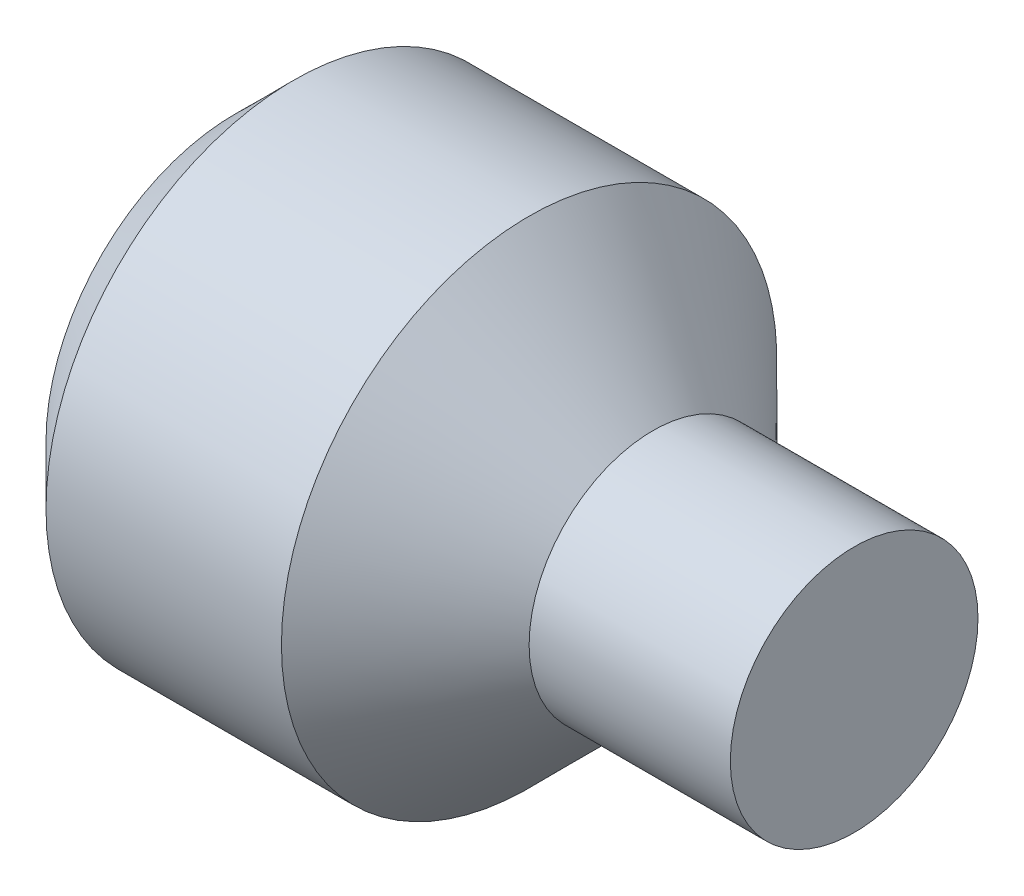
ISO-10303-21;
HEADER;
FILE_DESCRIPTION(('STEP AP214'),'2;1');
FILE_NAME('part.step','',(''),(''),'','','');
FILE_SCHEMA(('AUTOMOTIVE_DESIGN { 1 0 10303 214 1 1 1 1 }'));
ENDSEC;
DATA;
#1=APPLICATION_CONTEXT('core data for automotive mechanical design processes');
#2=APPLICATION_PROTOCOL_DEFINITION('international standard','automotive_design',2000,#1);
#3=PRODUCT_CONTEXT('',#1,'mechanical');
#4=PRODUCT('Part','Part','',(#3));
#5=PRODUCT_RELATED_PRODUCT_CATEGORY('part','',(#4));
#6=PRODUCT_DEFINITION_FORMATION('','',#4);
#7=PRODUCT_DEFINITION_CONTEXT('part definition',#1,'design');
#8=PRODUCT_DEFINITION('design','',#6,#7);
#9=PRODUCT_DEFINITION_SHAPE('','',#8);
#10=(LENGTH_UNIT() NAMED_UNIT(*) SI_UNIT(.MILLI.,.METRE.));
#11=(NAMED_UNIT(*) PLANE_ANGLE_UNIT() SI_UNIT($,.RADIAN.));
#12=(NAMED_UNIT(*) SI_UNIT($,.STERADIAN.) SOLID_ANGLE_UNIT());
#13=UNCERTAINTY_MEASURE_WITH_UNIT(LENGTH_MEASURE(1.E-05),#10,'distance_accuracy_value','');
#14=(GEOMETRIC_REPRESENTATION_CONTEXT(3) GLOBAL_UNCERTAINTY_ASSIGNED_CONTEXT((#13)) GLOBAL_UNIT_ASSIGNED_CONTEXT((#10,
#11,#12)) REPRESENTATION_CONTEXT('',''));
#15=CARTESIAN_POINT('',(0.,0.,0.));
#16=DIRECTION('',(0.,0.,1.));
#17=DIRECTION('',(1.,0.,0.));
#18=AXIS2_PLACEMENT_3D('',#15,#16,#17);
#19=CARTESIAN_POINT('',(0.699999999943163,0.350000000000001,0.606217782649104));
#20=DIRECTION('',(-1.,0.,0.));
#21=DIRECTION('',(0.,0.,1.));
#22=AXIS2_PLACEMENT_3D('',#19,#20,#21);
#23=PLANE('',#22);
#24=CARTESIAN_POINT('',(0.699999999943163,0.,0.));
#25=DIRECTION('',(-1.,0.,0.));
#26=DIRECTION('',(0.,0.,1.));
#27=AXIS2_PLACEMENT_3D('',#24,#25,#26);
#28=CIRCLE('',#27,0.35);
#29=CARTESIAN_POINT('',(0.699999999943163,0.175000000000001,0.303108891324552));
#30=VERTEX_POINT('',#29);
#31=CARTESIAN_POINT('',(0.699999999943163,0.350000000000001,0.));
#32=VERTEX_POINT('',#31);
#33=EDGE_CURVE('E50',#30,#32,#28,.T.);
#34=ORIENTED_EDGE('',*,*,#33,.F.);
#35=DIRECTION('',(0.,0.866025403784439,-0.5));
#36=VECTOR('',#35,1.);
#37=CARTESIAN_POINT('',(0.699999999943163,0.,0.404145188432736));
#38=LINE('',#37,#36);
#39=CARTESIAN_POINT('',(0.699999999943163,0.350000000000001,0.202072594216368));
#40=VERTEX_POINT('',#39);
#41=EDGE_CURVE('E245',#30,#40,#38,.T.);
#42=ORIENTED_EDGE('',*,*,#41,.T.);
#43=DIRECTION('',(0.,0.,-1.));
#44=VECTOR('',#43,1.);
#45=CARTESIAN_POINT('',(0.699999999943163,0.350000000000001,0.202072594216368));
#46=LINE('',#45,#44);
#47=EDGE_CURVE('E238',#40,#32,#46,.T.);
#48=ORIENTED_EDGE('',*,*,#47,.T.);
#49=EDGE_LOOP('',(#34,#42,#48));
#50=FACE_BOUND('',#49,.T.);
#51=ADVANCED_FACE('F39',(#50),#23,.T.);
#52=CARTESIAN_POINT('',(0.699999999943163,0.175000000000001,-0.303108891324552));
#53=VERTEX_POINT('',#52);
#54=EDGE_CURVE('E11',#32,#53,#28,.T.);
#55=ORIENTED_EDGE('',*,*,#54,.F.);
#56=CARTESIAN_POINT('',(0.699999999943163,0.350000000000001,-0.202072594216368));
#57=VERTEX_POINT('',#56);
#58=EDGE_CURVE('E241',#32,#57,#46,.T.);
#59=ORIENTED_EDGE('',*,*,#58,.T.);
#60=DIRECTION('',(0.,-0.866025403784439,-0.5));
#61=VECTOR('',#60,1.);
#62=CARTESIAN_POINT('',(0.699999999943163,0.350000000000001,-0.202072594216368));
#63=LINE('',#62,#61);
#64=EDGE_CURVE('E234',#57,#53,#63,.T.);
#65=ORIENTED_EDGE('',*,*,#64,.T.);
#66=EDGE_LOOP('',(#55,#59,#65));
#67=FACE_BOUND('',#66,.T.);
#68=ADVANCED_FACE('F126',(#67),#23,.T.);
#69=CARTESIAN_POINT('',(0.699999999943149,-0.174999999999999,-0.303108891324552));
#70=VERTEX_POINT('',#69);
#71=EDGE_CURVE('E48',#53,#70,#28,.T.);
#72=ORIENTED_EDGE('',*,*,#71,.F.);
#73=CARTESIAN_POINT('',(0.699999999943163,0.,-0.404145188432736));
#74=VERTEX_POINT('',#73);
#75=EDGE_CURVE('E237',#53,#74,#63,.T.);
#76=ORIENTED_EDGE('',*,*,#75,.T.);
#77=DIRECTION('',(0.,-0.866025403784439,0.5));
#78=VECTOR('',#77,1.);
#79=CARTESIAN_POINT('',(0.699999999943163,0.,-0.404145188432736));
#80=LINE('',#79,#78);
#81=EDGE_CURVE('E230',#74,#70,#80,.T.);
#82=ORIENTED_EDGE('',*,*,#81,.T.);
#83=EDGE_LOOP('',(#72,#76,#82));
#84=FACE_BOUND('',#83,.T.);
#85=ADVANCED_FACE('F131',(#84),#23,.T.);
#86=CARTESIAN_POINT('',(0.699999999943149,-0.35,0.));
#87=VERTEX_POINT('',#86);
#88=EDGE_CURVE('E249',#70,#87,#28,.T.);
#89=ORIENTED_EDGE('',*,*,#88,.F.);
#90=CARTESIAN_POINT('',(0.699999999943149,-0.349999999999999,-0.202072594216368));
#91=VERTEX_POINT('',#90);
#92=EDGE_CURVE('E233',#70,#91,#80,.T.);
#93=ORIENTED_EDGE('',*,*,#92,.T.);
#94=DIRECTION('',(0.,0.,1.));
#95=VECTOR('',#94,1.);
#96=CARTESIAN_POINT('',(0.699999999943149,-0.349999999999999,-0.202072594216368));
#97=LINE('',#96,#95);
#98=EDGE_CURVE('E201',#91,#87,#97,.T.);
#99=ORIENTED_EDGE('',*,*,#98,.T.);
#100=EDGE_LOOP('',(#89,#93,#99));
#101=FACE_BOUND('',#100,.T.);
#102=ADVANCED_FACE('F256',(#101),#23,.T.);
#103=CARTESIAN_POINT('',(0.699999999943149,-0.174999999999999,0.303108891324552));
#104=VERTEX_POINT('',#103);
#105=EDGE_CURVE('E57',#87,#104,#28,.T.);
#106=ORIENTED_EDGE('',*,*,#105,.F.);
#107=CARTESIAN_POINT('',(0.699999999943149,-0.349999999999999,0.202072594216368));
#108=VERTEX_POINT('',#107);
#109=EDGE_CURVE('E229',#87,#108,#97,.T.);
#110=ORIENTED_EDGE('',*,*,#109,.T.);
#111=DIRECTION('',(0.,0.866025403784439,0.5));
#112=VECTOR('',#111,1.);
#113=CARTESIAN_POINT('',(0.699999999943149,-0.349999999999999,0.202072594216368));
#114=LINE('',#113,#112);
#115=EDGE_CURVE('E246',#108,#104,#114,.T.);
#116=ORIENTED_EDGE('',*,*,#115,.T.);
#117=EDGE_LOOP('',(#106,#110,#116));
#118=FACE_BOUND('',#117,.T.);
#119=ADVANCED_FACE('F124',(#118),#23,.T.);
#120=CARTESIAN_POINT('',(0.,0.6105,0.));
#121=DIRECTION('',(1.,0.,0.));
#122=DIRECTION('',(0.,0.,-1.));
#123=AXIS2_PLACEMENT_3D('',#120,#121,#122);
#124=PLANE('',#123);
#125=DIRECTION('',(0.,0.866025403784439,-0.5));
#126=VECTOR('',#125,1.);
#127=CARTESIAN_POINT('',(-5.6843418860808E-11,0.,0.404145188432736));
#128=LINE('',#127,#126);
#129=CARTESIAN_POINT('',(0.,0.,0.404145188432736));
#130=VERTEX_POINT('',#129);
#131=CARTESIAN_POINT('',(-5.68295410730002E-11,0.35,0.202072594216368));
#132=VERTEX_POINT('',#131);
#133=EDGE_CURVE('E223',#130,#132,#128,.T.);
#134=ORIENTED_EDGE('',*,*,#133,.F.);
#135=DIRECTION('',(0.,0.866025403784439,0.5));
#136=VECTOR('',#135,1.);
#137=CARTESIAN_POINT('',(-5.68572966486158E-11,-0.35,0.202072594216368));
#138=LINE('',#137,#136);
#139=CARTESIAN_POINT('',(-5.68572966486158E-11,-0.35,0.202072594216368));
#140=VERTEX_POINT('',#139);
#141=EDGE_CURVE('E65',#140,#130,#138,.T.);
#142=ORIENTED_EDGE('',*,*,#141,.F.);
#143=DIRECTION('',(0.,0.,1.));
#144=VECTOR('',#143,1.);
#145=CARTESIAN_POINT('',(-5.68572966486158E-11,-0.35,-0.202072594216368));
#146=LINE('',#145,#144);
#147=CARTESIAN_POINT('',(-5.68572966486158E-11,-0.35,-0.202072594216368));
#148=VERTEX_POINT('',#147);
#149=EDGE_CURVE('E210',#148,#140,#146,.T.);
#150=ORIENTED_EDGE('',*,*,#149,.F.);
#151=DIRECTION('',(0.,-0.866025403784439,0.5));
#152=VECTOR('',#151,1.);
#153=CARTESIAN_POINT('',(-5.6843418860808E-11,0.,-0.404145188432736));
#154=LINE('',#153,#152);
#155=CARTESIAN_POINT('',(-5.6843418860808E-11,0.,-0.404145188432736));
#156=VERTEX_POINT('',#155);
#157=EDGE_CURVE('E214',#156,#148,#154,.T.);
#158=ORIENTED_EDGE('',*,*,#157,.F.);
#159=DIRECTION('',(0.,-0.866025403784439,-0.5));
#160=VECTOR('',#159,1.);
#161=CARTESIAN_POINT('',(-5.68295410730002E-11,0.35,-0.202072594216368));
#162=LINE('',#161,#160);
#163=CARTESIAN_POINT('',(-5.68295410730002E-11,0.35,-0.202072594216368));
#164=VERTEX_POINT('',#163);
#165=EDGE_CURVE('E217',#164,#156,#162,.T.);
#166=ORIENTED_EDGE('',*,*,#165,.F.);
#167=DIRECTION('',(0.,0.,-1.));
#168=VECTOR('',#167,1.);
#169=CARTESIAN_POINT('',(-5.68295410730002E-11,0.35,0.202072594216368));
#170=LINE('',#169,#168);
#171=EDGE_CURVE('E220',#132,#164,#170,.T.);
#172=ORIENTED_EDGE('',*,*,#171,.F.);
#173=EDGE_LOOP('',(#134,#142,#150,#158,#166,#172));
#174=FACE_BOUND('',#173,.T.);
#175=CARTESIAN_POINT('',(0.,0.,0.));
#176=DIRECTION('',(-1.,0.,0.));
#177=DIRECTION('',(0.,0.,1.));
#178=AXIS2_PLACEMENT_3D('',#175,#176,#177);
#179=CIRCLE('',#178,0.6105);
#180=CARTESIAN_POINT('',(0.,0.,0.6105));
#181=VERTEX_POINT('',#180);
#182=EDGE_CURVE('E43',#181,#181,#179,.T.);
#183=ORIENTED_EDGE('',*,*,#182,.T.);
#184=EDGE_LOOP('',(#183));
#185=FACE_BOUND('',#184,.T.);
#186=ADVANCED_FACE('F41',(#174,#185),#124,.F.);
#187=CARTESIAN_POINT('',(0.189500000000009,0.,0.));
#188=DIRECTION('',(1.,0.,0.));
#189=DIRECTION('',(0.,0.,-1.));
#190=AXIS2_PLACEMENT_3D('',#187,#188,#189);
#191=CONICAL_SURFACE('',#190,0.8,0.785398163397445);
#192=ORIENTED_EDGE('',*,*,#182,.F.);
#193=EDGE_LOOP('',(#192));
#194=FACE_BOUND('',#193,.T.);
#195=CARTESIAN_POINT('',(0.189500000000009,0.,0.));
#196=DIRECTION('',(-1.,0.,0.));
#197=DIRECTION('',(0.,0.,1.));
#198=AXIS2_PLACEMENT_3D('',#195,#196,#197);
#199=CIRCLE('',#198,0.8);
#200=CARTESIAN_POINT('',(0.189500000000009,0.,0.8));
#201=VERTEX_POINT('',#200);
#202=EDGE_CURVE('E184',#201,#201,#199,.T.);
#203=ORIENTED_EDGE('',*,*,#202,.T.);
#204=EDGE_LOOP('',(#203));
#205=FACE_BOUND('',#204,.T.);
#206=ADVANCED_FACE('F171',(#194,#205),#191,.T.);
#207=CARTESIAN_POINT('',(-1.96882056947004,0.,0.));
#208=DIRECTION('',(-1.,0.,0.));
#209=DIRECTION('',(0.,0.,1.));
#210=AXIS2_PLACEMENT_3D('',#207,#208,#209);
#211=CYLINDRICAL_SURFACE('',#210,0.8);
#212=ORIENTED_EDGE('',*,*,#202,.F.);
#213=EDGE_LOOP('',(#212));
#214=FACE_BOUND('',#213,.T.);
#215=CARTESIAN_POINT('',(0.950000000000006,0.,0.));
#216=DIRECTION('',(-1.,0.,0.));
#217=DIRECTION('',(0.,0.,1.));
#218=AXIS2_PLACEMENT_3D('',#215,#216,#217);
#219=CIRCLE('',#218,0.799999999999999);
#220=CARTESIAN_POINT('',(0.950000000000006,0.,0.799999999999999));
#221=VERTEX_POINT('',#220);
#222=EDGE_CURVE('E185',#221,#221,#219,.T.);
#223=ORIENTED_EDGE('',*,*,#222,.T.);
#224=EDGE_LOOP('',(#223));
#225=FACE_BOUND('',#224,.T.);
#226=ADVANCED_FACE('F168',(#214,#225),#211,.T.);
#227=CARTESIAN_POINT('',(1.34999999999999,0.,0.));
#228=DIRECTION('',(-1.,0.,0.));
#229=DIRECTION('',(0.,0.,1.));
#230=AXIS2_PLACEMENT_3D('',#227,#228,#229);
#231=CONICAL_SURFACE('',#230,0.4,0.785398163397449);
#232=ORIENTED_EDGE('',*,*,#222,.F.);
#233=EDGE_LOOP('',(#232));
#234=FACE_BOUND('',#233,.T.);
#235=CARTESIAN_POINT('',(1.34999999999999,0.,0.));
#236=DIRECTION('',(-1.,0.,0.));
#237=DIRECTION('',(0.,0.,1.));
#238=AXIS2_PLACEMENT_3D('',#235,#236,#237);
#239=CIRCLE('',#238,0.4);
#240=CARTESIAN_POINT('',(1.34999999999999,0.,0.4));
#241=VERTEX_POINT('',#240);
#242=EDGE_CURVE('E189',#241,#241,#239,.T.);
#243=ORIENTED_EDGE('',*,*,#242,.T.);
#244=EDGE_LOOP('',(#243));
#245=FACE_BOUND('',#244,.T.);
#246=ADVANCED_FACE('F164',(#234,#245),#231,.T.);
#247=CARTESIAN_POINT('',(-1.96882056947004,0.,0.));
#248=DIRECTION('',(-1.,0.,0.));
#249=DIRECTION('',(0.,0.,1.));
#250=AXIS2_PLACEMENT_3D('',#247,#248,#249);
#251=CYLINDRICAL_SURFACE('',#250,0.4);
#252=ORIENTED_EDGE('',*,*,#242,.F.);
#253=EDGE_LOOP('',(#252));
#254=FACE_BOUND('',#253,.T.);
#255=CARTESIAN_POINT('',(2.,0.,0.));
#256=DIRECTION('',(-1.,0.,0.));
#257=DIRECTION('',(0.,0.,1.));
#258=AXIS2_PLACEMENT_3D('',#255,#256,#257);
#259=CIRCLE('',#258,0.4);
#260=CARTESIAN_POINT('',(2.,0.,0.4));
#261=VERTEX_POINT('',#260);
#262=EDGE_CURVE('E194',#261,#261,#259,.T.);
#263=ORIENTED_EDGE('',*,*,#262,.T.);
#264=EDGE_LOOP('',(#263));
#265=FACE_BOUND('',#264,.T.);
#266=ADVANCED_FACE('F160',(#254,#265),#251,.T.);
#267=CARTESIAN_POINT('',(2.,0.,0.));
#268=DIRECTION('',(-1.,0.,0.));
#269=DIRECTION('',(0.,0.,1.));
#270=AXIS2_PLACEMENT_3D('',#267,#268,#269);
#271=PLANE('',#270);
#272=ORIENTED_EDGE('',*,*,#262,.F.);
#273=EDGE_LOOP('',(#272));
#274=FACE_BOUND('',#273,.T.);
#275=ADVANCED_FACE('F157',(#274),#271,.F.);
#276=CARTESIAN_POINT('',(0.699999999943149,-0.349999999999999,0.202072594216368));
#277=DIRECTION('',(0.,-0.5,0.866025403784439));
#278=DIRECTION('',(0.,-0.866025403784439,-0.5));
#279=AXIS2_PLACEMENT_3D('',#276,#277,#278);
#280=PLANE('',#279);
#281=ORIENTED_EDGE('',*,*,#141,.T.);
#282=DIRECTION('',(-1.,0.,0.));
#283=VECTOR('',#282,1.);
#284=CARTESIAN_POINT('',(0.699999999943163,0.,0.404145188432736));
#285=LINE('',#284,#283);
#286=CARTESIAN_POINT('',(0.699999999943163,0.,0.404145188432736));
#287=VERTEX_POINT('',#286);
#288=EDGE_CURVE('E198',#287,#130,#285,.T.);
#289=ORIENTED_EDGE('',*,*,#288,.F.);
#290=EDGE_CURVE('E213',#104,#287,#114,.T.);
#291=ORIENTED_EDGE('',*,*,#290,.F.);
#292=ORIENTED_EDGE('',*,*,#115,.F.);
#293=DIRECTION('',(-1.,0.,0.));
#294=VECTOR('',#293,1.);
#295=CARTESIAN_POINT('',(0.699999999943149,-0.349999999999999,0.202072594216368));
#296=LINE('',#295,#294);
#297=EDGE_CURVE('E197',#108,#140,#296,.T.);
#298=ORIENTED_EDGE('',*,*,#297,.T.);
#299=EDGE_LOOP('',(#281,#289,#291,#292,#298));
#300=FACE_BOUND('',#299,.T.);
#301=ADVANCED_FACE('F139',(#300),#280,.F.);
#302=CARTESIAN_POINT('',(0.699999999943149,-0.349999999999999,-0.202072594216368));
#303=DIRECTION('',(0.,-1.,0.));
#304=DIRECTION('',(0.,0.,-1.));
#305=AXIS2_PLACEMENT_3D('',#302,#303,#304);
#306=PLANE('',#305);
#307=ORIENTED_EDGE('',*,*,#149,.T.);
#308=ORIENTED_EDGE('',*,*,#297,.F.);
#309=ORIENTED_EDGE('',*,*,#109,.F.);
#310=ORIENTED_EDGE('',*,*,#98,.F.);
#311=DIRECTION('',(-1.,0.,0.));
#312=VECTOR('',#311,1.);
#313=CARTESIAN_POINT('',(0.699999999943149,-0.349999999999999,-0.202072594216368));
#314=LINE('',#313,#312);
#315=EDGE_CURVE('E207',#91,#148,#314,.T.);
#316=ORIENTED_EDGE('',*,*,#315,.T.);
#317=EDGE_LOOP('',(#307,#308,#309,#310,#316));
#318=FACE_BOUND('',#317,.T.);
#319=ADVANCED_FACE('F135',(#318),#306,.F.);
#320=CARTESIAN_POINT('',(0.699999999943163,0.,-0.404145188432736));
#321=DIRECTION('',(0.,-0.5,-0.866025403784439));
#322=DIRECTION('',(0.,0.866025403784439,-0.5));
#323=AXIS2_PLACEMENT_3D('',#320,#321,#322);
#324=PLANE('',#323);
#325=ORIENTED_EDGE('',*,*,#157,.T.);
#326=ORIENTED_EDGE('',*,*,#315,.F.);
#327=ORIENTED_EDGE('',*,*,#92,.F.);
#328=ORIENTED_EDGE('',*,*,#81,.F.);
#329=DIRECTION('',(-1.,0.,0.));
#330=VECTOR('',#329,1.);
#331=CARTESIAN_POINT('',(0.699999999943163,0.,-0.404145188432736));
#332=LINE('',#331,#330);
#333=EDGE_CURVE('E205',#74,#156,#332,.T.);
#334=ORIENTED_EDGE('',*,*,#333,.T.);
#335=EDGE_LOOP('',(#325,#326,#327,#328,#334));
#336=FACE_BOUND('',#335,.T.);
#337=ADVANCED_FACE('F138',(#336),#324,.F.);
#338=CARTESIAN_POINT('',(0.699999999943163,0.350000000000001,-0.202072594216368));
#339=DIRECTION('',(0.,0.5,-0.866025403784439));
#340=DIRECTION('',(0.,0.866025403784439,0.5));
#341=AXIS2_PLACEMENT_3D('',#338,#339,#340);
#342=PLANE('',#341);
#343=ORIENTED_EDGE('',*,*,#165,.T.);
#344=ORIENTED_EDGE('',*,*,#333,.F.);
#345=ORIENTED_EDGE('',*,*,#75,.F.);
#346=ORIENTED_EDGE('',*,*,#64,.F.);
#347=DIRECTION('',(-1.,0.,0.));
#348=VECTOR('',#347,1.);
#349=CARTESIAN_POINT('',(0.699999999943163,0.350000000000001,-0.202072594216368));
#350=LINE('',#349,#348);
#351=EDGE_CURVE('E203',#57,#164,#350,.T.);
#352=ORIENTED_EDGE('',*,*,#351,.T.);
#353=EDGE_LOOP('',(#343,#344,#345,#346,#352));
#354=FACE_BOUND('',#353,.T.);
#355=ADVANCED_FACE('F143',(#354),#342,.F.);
#356=CARTESIAN_POINT('',(0.699999999943163,0.350000000000001,0.202072594216368));
#357=DIRECTION('',(0.,1.,0.));
#358=DIRECTION('',(0.,0.,1.));
#359=AXIS2_PLACEMENT_3D('',#356,#357,#358);
#360=PLANE('',#359);
#361=ORIENTED_EDGE('',*,*,#171,.T.);
#362=ORIENTED_EDGE('',*,*,#351,.F.);
#363=ORIENTED_EDGE('',*,*,#58,.F.);
#364=ORIENTED_EDGE('',*,*,#47,.F.);
#365=DIRECTION('',(-1.,0.,0.));
#366=VECTOR('',#365,1.);
#367=CARTESIAN_POINT('',(0.699999999943163,0.350000000000001,0.202072594216368));
#368=LINE('',#367,#366);
#369=EDGE_CURVE('E200',#40,#132,#368,.T.);
#370=ORIENTED_EDGE('',*,*,#369,.T.);
#371=EDGE_LOOP('',(#361,#362,#363,#364,#370));
#372=FACE_BOUND('',#371,.T.);
#373=ADVANCED_FACE('F147',(#372),#360,.F.);
#374=CARTESIAN_POINT('',(0.699999999943163,0.,0.404145188432736));
#375=DIRECTION('',(0.,0.5,0.866025403784439));
#376=DIRECTION('',(0.,-0.866025403784439,0.5));
#377=AXIS2_PLACEMENT_3D('',#374,#375,#376);
#378=PLANE('',#377);
#379=ORIENTED_EDGE('',*,*,#133,.T.);
#380=ORIENTED_EDGE('',*,*,#369,.F.);
#381=ORIENTED_EDGE('',*,*,#41,.F.);
#382=EDGE_CURVE('E242',#287,#30,#38,.T.);
#383=ORIENTED_EDGE('',*,*,#382,.F.);
#384=ORIENTED_EDGE('',*,*,#288,.T.);
#385=EDGE_LOOP('',(#379,#380,#381,#383,#384));
#386=FACE_BOUND('',#385,.T.);
#387=ADVANCED_FACE('F121',(#386),#378,.F.);
#388=EDGE_CURVE('E187',#104,#30,#28,.T.);
#389=ORIENTED_EDGE('',*,*,#388,.F.);
#390=ORIENTED_EDGE('',*,*,#290,.T.);
#391=ORIENTED_EDGE('',*,*,#382,.T.);
#392=EDGE_LOOP('',(#389,#390,#391));
#393=FACE_BOUND('',#392,.T.);
#394=ADVANCED_FACE('F116',(#393),#23,.T.);
#395=CARTESIAN_POINT('',(0.839999999943164,0.,0.));
#396=DIRECTION('',(-1.,0.,0.));
#397=DIRECTION('',(0.,0.,1.));
#398=AXIS2_PLACEMENT_3D('',#395,#396,#397);
#399=CONICAL_SURFACE('',#398,0.,1.19028994968253);
#400=ORIENTED_EDGE('',*,*,#33,.T.);
#401=ORIENTED_EDGE('',*,*,#54,.T.);
#402=ORIENTED_EDGE('',*,*,#71,.T.);
#403=ORIENTED_EDGE('',*,*,#88,.T.);
#404=ORIENTED_EDGE('',*,*,#105,.T.);
#405=ORIENTED_EDGE('',*,*,#388,.T.);
#406=EDGE_LOOP('',(#400,#401,#402,#403,#404,#405));
#407=FACE_BOUND('',#406,.T.);
#408=CARTESIAN_POINT('',(0.839999999943164,0.,0.));
#409=VERTEX_POINT('',#408);
#410=VERTEX_LOOP('',#409);
#411=FACE_BOUND('',#410,.T.);
#412=ADVANCED_FACE('F114',(#407,#411),#399,.F.);
#413=CLOSED_SHELL('',(#51,#68,#85,#102,#119,#186,#206,#226,#246,#266,#275,#301,#319,#337,#355,
#373,#387,#394,#412));
#414=MANIFOLD_SOLID_BREP('B2',#413);
#415=ADVANCED_BREP_SHAPE_REPRESENTATION('',(#18,#414),#14);
#416=SHAPE_DEFINITION_REPRESENTATION(#9,#415);
ENDSEC;
END-ISO-10303-21;
